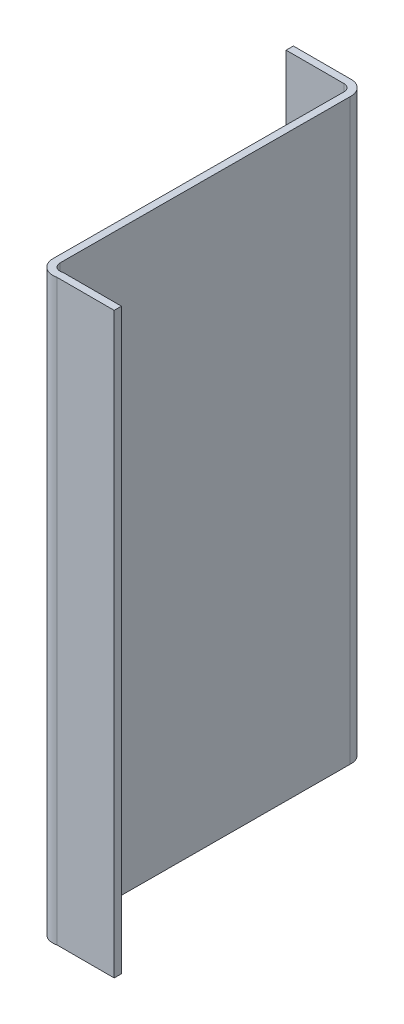
ISO-10303-21;
HEADER;
FILE_DESCRIPTION(('STEP AP214'),'2;1');
FILE_NAME('part.step','',(''),(''),'','','');
FILE_SCHEMA(('AUTOMOTIVE_DESIGN { 1 0 10303 214 1 1 1 1 }'));
ENDSEC;
DATA;
#1=APPLICATION_CONTEXT('core data for automotive mechanical design processes');
#2=APPLICATION_PROTOCOL_DEFINITION('international standard','automotive_design',2000,#1);
#3=PRODUCT_CONTEXT('',#1,'mechanical');
#4=PRODUCT('Part','Part','',(#3));
#5=PRODUCT_RELATED_PRODUCT_CATEGORY('part','',(#4));
#6=PRODUCT_DEFINITION_FORMATION('','',#4);
#7=PRODUCT_DEFINITION_CONTEXT('part definition',#1,'design');
#8=PRODUCT_DEFINITION('design','',#6,#7);
#9=PRODUCT_DEFINITION_SHAPE('','',#8);
#10=(LENGTH_UNIT() NAMED_UNIT(*) SI_UNIT(.MILLI.,.METRE.));
#11=(NAMED_UNIT(*) PLANE_ANGLE_UNIT() SI_UNIT($,.RADIAN.));
#12=(NAMED_UNIT(*) SI_UNIT($,.STERADIAN.) SOLID_ANGLE_UNIT());
#13=UNCERTAINTY_MEASURE_WITH_UNIT(LENGTH_MEASURE(1.E-05),#10,'distance_accuracy_value','');
#14=(GEOMETRIC_REPRESENTATION_CONTEXT(3) GLOBAL_UNCERTAINTY_ASSIGNED_CONTEXT((#13)) GLOBAL_UNIT_ASSIGNED_CONTEXT((#10,
#11,#12)) REPRESENTATION_CONTEXT('',''));
#15=CARTESIAN_POINT('',(0.,0.,0.));
#16=DIRECTION('',(0.,0.,1.));
#17=DIRECTION('',(1.,0.,0.));
#18=AXIS2_PLACEMENT_3D('',#15,#16,#17);
#19=CARTESIAN_POINT('',(9.66073389923838,400.,64.2333395643542));
#20=DIRECTION('',(0.,0.,-1.));
#21=DIRECTION('',(-1.,0.,0.));
#22=AXIS2_PLACEMENT_3D('',#19,#20,#21);
#23=PLANE('',#22);
#24=DIRECTION('',(1.,0.,0.));
#25=VECTOR('',#24,1.);
#26=CARTESIAN_POINT('',(9.66073389923838,0.,64.2333395643542));
#27=LINE('',#26,#25);
#28=CARTESIAN_POINT('',(10.0017111143668,0.,64.2333395643542));
#29=VERTEX_POINT('',#28);
#30=CARTESIAN_POINT('',(49.661853535489,0.,64.2333395643542));
#31=VERTEX_POINT('',#30);
#32=EDGE_CURVE('E164',#29,#31,#27,.T.);
#33=ORIENTED_EDGE('',*,*,#32,.T.);
#34=DIRECTION('',(0.,-1.,0.));
#35=VECTOR('',#34,1.);
#36=CARTESIAN_POINT('',(49.661853535489,400.,64.2333395643542));
#37=LINE('',#36,#35);
#38=CARTESIAN_POINT('',(49.661853535489,400.,64.2333395643542));
#39=VERTEX_POINT('',#38);
#40=EDGE_CURVE('E11',#39,#31,#37,.T.);
#41=ORIENTED_EDGE('',*,*,#40,.F.);
#42=DIRECTION('',(1.,0.,0.));
#43=VECTOR('',#42,1.);
#44=CARTESIAN_POINT('',(9.66073389923838,400.,64.2333395643542));
#45=LINE('',#44,#43);
#46=CARTESIAN_POINT('',(10.0017111143668,400.,64.2333395643542));
#47=VERTEX_POINT('',#46);
#48=EDGE_CURVE('E108',#47,#39,#45,.T.);
#49=ORIENTED_EDGE('',*,*,#48,.F.);
#50=DIRECTION('',(0.,-1.,0.));
#51=VECTOR('',#50,1.);
#52=CARTESIAN_POINT('',(10.0017111143668,400.,64.2333395643542));
#53=LINE('',#52,#51);
#54=EDGE_CURVE('E160',#47,#29,#53,.T.);
#55=ORIENTED_EDGE('',*,*,#54,.T.);
#56=EDGE_LOOP('',(#33,#41,#49,#55));
#57=FACE_BOUND('',#56,.T.);
#58=ADVANCED_FACE('F39',(#57),#23,.F.);
#59=CARTESIAN_POINT('',(49.661853535489,400.,59.2333395643542));
#60=DIRECTION('',(1.,0.,0.));
#61=DIRECTION('',(0.,0.,-1.));
#62=AXIS2_PLACEMENT_3D('',#59,#60,#61);
#63=PLANE('',#62);
#64=DIRECTION('',(0.,0.,1.));
#65=VECTOR('',#64,1.);
#66=CARTESIAN_POINT('',(49.661853535489,0.,59.2333395643542));
#67=LINE('',#66,#65);
#68=CARTESIAN_POINT('',(49.661853535489,0.,59.2333395643542));
#69=VERTEX_POINT('',#68);
#70=EDGE_CURVE('E168',#69,#31,#67,.T.);
#71=ORIENTED_EDGE('',*,*,#70,.F.);
#72=DIRECTION('',(0.,-1.,0.));
#73=VECTOR('',#72,1.);
#74=CARTESIAN_POINT('',(49.661853535489,400.,59.2333395643542));
#75=LINE('',#74,#73);
#76=CARTESIAN_POINT('',(49.661853535489,400.,59.2333395643542));
#77=VERTEX_POINT('',#76);
#78=EDGE_CURVE('E48',#77,#69,#75,.T.);
#79=ORIENTED_EDGE('',*,*,#78,.F.);
#80=DIRECTION('',(0.,0.,1.));
#81=VECTOR('',#80,1.);
#82=CARTESIAN_POINT('',(49.661853535489,400.,59.2333395643542));
#83=LINE('',#82,#81);
#84=EDGE_CURVE('E251',#77,#39,#83,.T.);
#85=ORIENTED_EDGE('',*,*,#84,.T.);
#86=ORIENTED_EDGE('',*,*,#40,.T.);
#87=EDGE_LOOP('',(#71,#79,#85,#86));
#88=FACE_BOUND('',#87,.T.);
#89=ADVANCED_FACE('F238',(#88),#63,.T.);
#90=CARTESIAN_POINT('',(9.66073389923838,400.,59.2333395643542));
#91=DIRECTION('',(0.,0.,-1.));
#92=DIRECTION('',(-1.,0.,0.));
#93=AXIS2_PLACEMENT_3D('',#90,#91,#92);
#94=PLANE('',#93);
#95=DIRECTION('',(1.,0.,0.));
#96=VECTOR('',#95,1.);
#97=CARTESIAN_POINT('',(9.66073389923838,0.,59.2333395643542));
#98=LINE('',#97,#96);
#99=CARTESIAN_POINT('',(9.25469740413768,0.,59.2333395643542));
#100=VERTEX_POINT('',#99);
#101=EDGE_CURVE('E172',#100,#69,#98,.T.);
#102=ORIENTED_EDGE('',*,*,#101,.F.);
#103=DIRECTION('',(0.,-1.,0.));
#104=VECTOR('',#103,1.);
#105=CARTESIAN_POINT('',(9.25469740413768,400.,59.2333395643542));
#106=LINE('',#105,#104);
#107=CARTESIAN_POINT('',(9.25469740413768,400.,59.2333395643542));
#108=VERTEX_POINT('',#107);
#109=EDGE_CURVE('E226',#108,#100,#106,.T.);
#110=ORIENTED_EDGE('',*,*,#109,.F.);
#111=DIRECTION('',(1.,0.,0.));
#112=VECTOR('',#111,1.);
#113=CARTESIAN_POINT('',(9.66073389923838,400.,59.2333395643542));
#114=LINE('',#113,#112);
#115=EDGE_CURVE('E235',#108,#77,#114,.T.);
#116=ORIENTED_EDGE('',*,*,#115,.T.);
#117=ORIENTED_EDGE('',*,*,#78,.T.);
#118=EDGE_LOOP('',(#102,#110,#116,#117));
#119=FACE_BOUND('',#118,.T.);
#120=ADVANCED_FACE('F233',(#119),#94,.T.);
#121=CARTESIAN_POINT('',(7.50015744719507,400.,54.5510656614804));
#122=DIRECTION('',(0.,-1.,0.));
#123=DIRECTION('',(0.,0.,-1.));
#124=AXIS2_PLACEMENT_3D('',#121,#122,#123);
#125=CYLINDRICAL_SURFACE('',#124,5.00020993179699);
#126=CARTESIAN_POINT('',(7.50015744719507,0.,54.5510656614804));
#127=DIRECTION('',(0.,1.,0.));
#128=DIRECTION('',(1.,0.,0.));
#129=AXIS2_PLACEMENT_3D('',#126,#127,#128);
#130=CIRCLE('',#129,5.00020993179699);
#131=CARTESIAN_POINT('',(2.49998250562238,0.,54.532359627433));
#132=VERTEX_POINT('',#131);
#133=EDGE_CURVE('E176',#132,#100,#130,.T.);
#134=ORIENTED_EDGE('',*,*,#133,.F.);
#135=DIRECTION('',(0.,-1.,0.));
#136=VECTOR('',#135,1.);
#137=CARTESIAN_POINT('',(2.49998250562238,400.,54.532359627433));
#138=LINE('',#137,#136);
#139=CARTESIAN_POINT('',(2.49998250562238,400.,54.532359627433));
#140=VERTEX_POINT('',#139);
#141=EDGE_CURVE('E223',#140,#132,#138,.T.);
#142=ORIENTED_EDGE('',*,*,#141,.F.);
#143=CARTESIAN_POINT('',(7.50015744719507,400.,54.5510656614804));
#144=DIRECTION('',(0.,1.,0.));
#145=DIRECTION('',(1.,0.,0.));
#146=AXIS2_PLACEMENT_3D('',#143,#144,#145);
#147=CIRCLE('',#146,5.00020993179699);
#148=EDGE_CURVE('E248',#140,#108,#147,.T.);
#149=ORIENTED_EDGE('',*,*,#148,.T.);
#150=ORIENTED_EDGE('',*,*,#109,.T.);
#151=EDGE_LOOP('',(#134,#142,#149,#150));
#152=FACE_BOUND('',#151,.T.);
#153=ADVANCED_FACE('F245',(#152),#125,.F.);
#154=CARTESIAN_POINT('',(3.24819768872956,400.,-145.467640372567));
#155=DIRECTION('',(0.999993002248951,0.,0.00374104973641801));
#156=DIRECTION('',(0.00374104973641801,0.,-0.999993002248951));
#157=AXIS2_PLACEMENT_3D('',#154,#155,#156);
#158=PLANE('',#157);
#159=DIRECTION('',(-0.00374104973641801,0.,0.999993002248951));
#160=VECTOR('',#159,1.);
#161=CARTESIAN_POINT('',(3.24819768872956,0.,-145.467640372567));
#162=LINE('',#161,#160);
#163=CARTESIAN_POINT('',(3.24784526707235,0.,-145.373437083146));
#164=VERTEX_POINT('',#163);
#165=EDGE_CURVE('E180',#164,#132,#162,.T.);
#166=ORIENTED_EDGE('',*,*,#165,.F.);
#167=DIRECTION('',(0.,-1.,0.));
#168=VECTOR('',#167,1.);
#169=CARTESIAN_POINT('',(3.24784526707235,400.,-145.373437083146));
#170=LINE('',#169,#168);
#171=CARTESIAN_POINT('',(3.24784526707235,400.,-145.373437083146));
#172=VERTEX_POINT('',#171);
#173=EDGE_CURVE('E220',#172,#164,#170,.T.);
#174=ORIENTED_EDGE('',*,*,#173,.F.);
#175=DIRECTION('',(-0.00374104973641801,0.,0.999993002248951));
#176=VECTOR('',#175,1.);
#177=CARTESIAN_POINT('',(3.24819768872956,400.,-145.467640372567));
#178=LINE('',#177,#176);
#179=EDGE_CURVE('E256',#172,#140,#178,.T.);
#180=ORIENTED_EDGE('',*,*,#179,.T.);
#181=ORIENTED_EDGE('',*,*,#141,.T.);
#182=EDGE_LOOP('',(#166,#174,#180,#181));
#183=FACE_BOUND('',#182,.T.);
#184=ADVANCED_FACE('F361',(#183),#158,.T.);
#185=CARTESIAN_POINT('',(-6.72498157597232,400.,-146.11297980582));
#186=DIRECTION('',(0.,-1.,0.));
#187=DIRECTION('',(0.,0.,-1.));
#188=AXIS2_PLACEMENT_3D('',#185,#186,#187);
#189=CYLINDRICAL_SURFACE('',#188,10.000209931797);
#190=CARTESIAN_POINT('',(-6.72498157597232,0.,-146.11297980582));
#191=DIRECTION('',(0.,1.,0.));
#192=DIRECTION('',(1.,0.,0.));
#193=AXIS2_PLACEMENT_3D('',#190,#191,#192);
#194=CIRCLE('',#193,10.000209931797);
#195=CARTESIAN_POINT('',(-6.72498157597232,0.,-156.113189737617));
#196=VERTEX_POINT('',#195);
#197=EDGE_CURVE('E184',#196,#164,#194,.F.);
#198=ORIENTED_EDGE('',*,*,#197,.F.);
#199=DIRECTION('',(0.,-1.,0.));
#200=VECTOR('',#199,1.);
#201=CARTESIAN_POINT('',(-6.72498157597232,400.,-156.113189737617));
#202=LINE('',#201,#200);
#203=CARTESIAN_POINT('',(-6.72498157597232,400.,-156.113189737617));
#204=VERTEX_POINT('',#203);
#205=EDGE_CURVE('E217',#204,#196,#202,.T.);
#206=ORIENTED_EDGE('',*,*,#205,.F.);
#207=CARTESIAN_POINT('',(-6.72498157597232,400.,-146.11297980582));
#208=DIRECTION('',(0.,1.,0.));
#209=DIRECTION('',(1.,0.,0.));
#210=AXIS2_PLACEMENT_3D('',#207,#208,#209);
#211=CIRCLE('',#210,10.000209931797);
#212=EDGE_CURVE('E263',#204,#172,#211,.F.);
#213=ORIENTED_EDGE('',*,*,#212,.T.);
#214=ORIENTED_EDGE('',*,*,#173,.T.);
#215=EDGE_LOOP('',(#198,#206,#213,#214));
#216=FACE_BOUND('',#215,.T.);
#217=ADVANCED_FACE('F352',(#216),#189,.T.);
#218=CARTESIAN_POINT('',(-46.726101212223,400.,-156.113189737617));
#219=DIRECTION('',(0.,0.,-1.));
#220=DIRECTION('',(-1.,0.,0.));
#221=AXIS2_PLACEMENT_3D('',#218,#219,#220);
#222=PLANE('',#221);
#223=DIRECTION('',(1.,0.,0.));
#224=VECTOR('',#223,1.);
#225=CARTESIAN_POINT('',(-46.726101212223,0.,-156.113189737617));
#226=LINE('',#225,#224);
#227=CARTESIAN_POINT('',(-46.726101212223,0.,-156.113189737617));
#228=VERTEX_POINT('',#227);
#229=EDGE_CURVE('E188',#228,#196,#226,.T.);
#230=ORIENTED_EDGE('',*,*,#229,.F.);
#231=DIRECTION('',(0.,-1.,0.));
#232=VECTOR('',#231,1.);
#233=CARTESIAN_POINT('',(-46.726101212223,400.,-156.113189737617));
#234=LINE('',#233,#232);
#235=CARTESIAN_POINT('',(-46.726101212223,400.,-156.113189737617));
#236=VERTEX_POINT('',#235);
#237=EDGE_CURVE('E214',#236,#228,#234,.T.);
#238=ORIENTED_EDGE('',*,*,#237,.F.);
#239=DIRECTION('',(1.,0.,0.));
#240=VECTOR('',#239,1.);
#241=CARTESIAN_POINT('',(-46.726101212223,400.,-156.113189737617));
#242=LINE('',#241,#240);
#243=EDGE_CURVE('E267',#236,#204,#242,.T.);
#244=ORIENTED_EDGE('',*,*,#243,.T.);
#245=ORIENTED_EDGE('',*,*,#205,.T.);
#246=EDGE_LOOP('',(#230,#238,#244,#245));
#247=FACE_BOUND('',#246,.T.);
#248=ADVANCED_FACE('F282',(#247),#222,.T.);
#249=CARTESIAN_POINT('',(-46.726101212223,400.,-151.113189737617));
#250=DIRECTION('',(-1.,0.,0.));
#251=DIRECTION('',(0.,0.,1.));
#252=AXIS2_PLACEMENT_3D('',#249,#250,#251);
#253=PLANE('',#252);
#254=DIRECTION('',(0.,0.,-1.));
#255=VECTOR('',#254,1.);
#256=CARTESIAN_POINT('',(-46.726101212223,0.,-151.113189737617));
#257=LINE('',#256,#255);
#258=CARTESIAN_POINT('',(-46.726101212223,0.,-151.113189737617));
#259=VERTEX_POINT('',#258);
#260=EDGE_CURVE('E192',#259,#228,#257,.T.);
#261=ORIENTED_EDGE('',*,*,#260,.F.);
#262=DIRECTION('',(0.,-1.,0.));
#263=VECTOR('',#262,1.);
#264=CARTESIAN_POINT('',(-46.726101212223,400.,-151.113189737617));
#265=LINE('',#264,#263);
#266=CARTESIAN_POINT('',(-46.726101212223,400.,-151.113189737617));
#267=VERTEX_POINT('',#266);
#268=EDGE_CURVE('E211',#267,#259,#265,.T.);
#269=ORIENTED_EDGE('',*,*,#268,.F.);
#270=DIRECTION('',(0.,0.,-1.));
#271=VECTOR('',#270,1.);
#272=CARTESIAN_POINT('',(-46.726101212223,400.,-151.113189737617));
#273=LINE('',#272,#271);
#274=EDGE_CURVE('E271',#267,#236,#273,.T.);
#275=ORIENTED_EDGE('',*,*,#274,.T.);
#276=ORIENTED_EDGE('',*,*,#237,.T.);
#277=EDGE_LOOP('',(#261,#269,#275,#276));
#278=FACE_BOUND('',#277,.T.);
#279=ADVANCED_FACE('F277',(#278),#253,.T.);
#280=CARTESIAN_POINT('',(-46.726101212223,400.,-151.113189737617));
#281=DIRECTION('',(0.,0.,-1.));
#282=DIRECTION('',(-1.,0.,0.));
#283=AXIS2_PLACEMENT_3D('',#280,#281,#282);
#284=PLANE('',#283);
#285=DIRECTION('',(1.,0.,0.));
#286=VECTOR('',#285,1.);
#287=CARTESIAN_POINT('',(-46.726101212223,0.,-151.113189737617));
#288=LINE('',#287,#286);
#289=CARTESIAN_POINT('',(-6.72498157597232,0.,-151.113189737617));
#290=VERTEX_POINT('',#289);
#291=EDGE_CURVE('E196',#259,#290,#288,.T.);
#292=ORIENTED_EDGE('',*,*,#291,.T.);
#293=DIRECTION('',(0.,-1.,0.));
#294=VECTOR('',#293,1.);
#295=CARTESIAN_POINT('',(-6.72498157597232,400.,-151.113189737617));
#296=LINE('',#295,#294);
#297=CARTESIAN_POINT('',(-6.72498157597232,400.,-151.113189737617));
#298=VERTEX_POINT('',#297);
#299=EDGE_CURVE('E153',#298,#290,#296,.T.);
#300=ORIENTED_EDGE('',*,*,#299,.F.);
#301=DIRECTION('',(1.,0.,0.));
#302=VECTOR('',#301,1.);
#303=CARTESIAN_POINT('',(-46.726101212223,400.,-151.113189737617));
#304=LINE('',#303,#302);
#305=EDGE_CURVE('E142',#267,#298,#304,.T.);
#306=ORIENTED_EDGE('',*,*,#305,.F.);
#307=ORIENTED_EDGE('',*,*,#268,.T.);
#308=EDGE_LOOP('',(#292,#300,#306,#307));
#309=FACE_BOUND('',#308,.T.);
#310=ADVANCED_FACE('F286',(#309),#284,.F.);
#311=CARTESIAN_POINT('',(-6.72498157597232,400.,-146.11297980582));
#312=DIRECTION('',(0.,-1.,0.));
#313=DIRECTION('',(0.,0.,-1.));
#314=AXIS2_PLACEMENT_3D('',#311,#312,#313);
#315=CYLINDRICAL_SURFACE('',#314,5.000209931797);
#316=CARTESIAN_POINT('',(-6.72498157597232,0.,-146.11297980582));
#317=DIRECTION('',(0.,1.,0.));
#318=DIRECTION('',(1.,0.,0.));
#319=AXIS2_PLACEMENT_3D('',#316,#317,#318);
#320=CIRCLE('',#319,5.000209931797);
#321=CARTESIAN_POINT('',(-1.75134916379334,0.,-145.598120610929));
#322=VERTEX_POINT('',#321);
#323=EDGE_CURVE('E151',#290,#322,#320,.F.);
#324=ORIENTED_EDGE('',*,*,#323,.T.);
#325=DIRECTION('',(0.,-1.,0.));
#326=VECTOR('',#325,1.);
#327=CARTESIAN_POINT('',(-1.75134916379334,400.,-145.598120610929));
#328=LINE('',#327,#326);
#329=CARTESIAN_POINT('',(-1.75134916379334,400.,-145.598120610929));
#330=VERTEX_POINT('',#329);
#331=EDGE_CURVE('E148',#330,#322,#328,.T.);
#332=ORIENTED_EDGE('',*,*,#331,.F.);
#333=CARTESIAN_POINT('',(-6.72498157597232,400.,-146.11297980582));
#334=DIRECTION('',(0.,1.,0.));
#335=DIRECTION('',(1.,0.,0.));
#336=AXIS2_PLACEMENT_3D('',#333,#334,#335);
#337=CIRCLE('',#336,5.000209931797);
#338=EDGE_CURVE('E135',#298,#330,#337,.F.);
#339=ORIENTED_EDGE('',*,*,#338,.F.);
#340=ORIENTED_EDGE('',*,*,#299,.T.);
#341=EDGE_LOOP('',(#324,#332,#339,#340));
#342=FACE_BOUND('',#341,.T.);
#343=ADVANCED_FACE('F149',(#342),#315,.F.);
#344=CARTESIAN_POINT('',(-1.75176732251519,400.,-145.486345621249));
#345=DIRECTION('',(0.999993002248951,0.,0.00374104973641801));
#346=DIRECTION('',(0.00374104973641801,0.,-0.999993002248951));
#347=AXIS2_PLACEMENT_3D('',#344,#345,#346);
#348=PLANE('',#347);
#349=DIRECTION('',(-0.00374104973641801,0.,0.999993002248951));
#350=VECTOR('',#349,1.);
#351=CARTESIAN_POINT('',(-1.75176732251519,0.,-145.486345621249));
#352=LINE('',#351,#350);
#353=CARTESIAN_POINT('',(-2.49998250562238,0.,54.5136543787509));
#354=VERTEX_POINT('',#353);
#355=EDGE_CURVE('E96',#322,#354,#352,.T.);
#356=ORIENTED_EDGE('',*,*,#355,.T.);
#357=DIRECTION('',(0.,-1.,0.));
#358=VECTOR('',#357,1.);
#359=CARTESIAN_POINT('',(-2.49998250562238,400.,54.5136543787509));
#360=LINE('',#359,#358);
#361=CARTESIAN_POINT('',(-2.49998250562238,400.,54.5136543787509));
#362=VERTEX_POINT('',#361);
#363=EDGE_CURVE('E154',#362,#354,#360,.T.);
#364=ORIENTED_EDGE('',*,*,#363,.F.);
#365=DIRECTION('',(-0.00374104973641801,0.,0.999993002248951));
#366=VECTOR('',#365,1.);
#367=CARTESIAN_POINT('',(-1.75176732251519,400.,-145.486345621249));
#368=LINE('',#367,#366);
#369=EDGE_CURVE('E139',#330,#362,#368,.T.);
#370=ORIENTED_EDGE('',*,*,#369,.F.);
#371=ORIENTED_EDGE('',*,*,#331,.T.);
#372=EDGE_LOOP('',(#356,#364,#370,#371));
#373=FACE_BOUND('',#372,.T.);
#374=ADVANCED_FACE('F156',(#373),#348,.F.);
#375=CARTESIAN_POINT('',(7.50015744719507,400.,54.5510656614804));
#376=DIRECTION('',(0.,-1.,0.));
#377=DIRECTION('',(0.,0.,-1.));
#378=AXIS2_PLACEMENT_3D('',#375,#376,#377);
#379=CYLINDRICAL_SURFACE('',#378,10.000209931797);
#380=CARTESIAN_POINT('',(7.50015744719507,0.,54.5510656614804));
#381=DIRECTION('',(0.,1.,0.));
#382=DIRECTION('',(1.,0.,0.));
#383=AXIS2_PLACEMENT_3D('',#380,#381,#382);
#384=CIRCLE('',#383,10.000209931797);
#385=EDGE_CURVE('E102',#354,#29,#384,.T.);
#386=ORIENTED_EDGE('',*,*,#385,.T.);
#387=ORIENTED_EDGE('',*,*,#54,.F.);
#388=CARTESIAN_POINT('',(7.50015744719507,400.,54.5510656614804));
#389=DIRECTION('',(0.,1.,0.));
#390=DIRECTION('',(1.,0.,0.));
#391=AXIS2_PLACEMENT_3D('',#388,#389,#390);
#392=CIRCLE('',#391,10.000209931797);
#393=EDGE_CURVE('E56',#362,#47,#392,.T.);
#394=ORIENTED_EDGE('',*,*,#393,.F.);
#395=ORIENTED_EDGE('',*,*,#363,.T.);
#396=EDGE_LOOP('',(#386,#387,#394,#395));
#397=FACE_BOUND('',#396,.T.);
#398=ADVANCED_FACE('F300',(#397),#379,.T.);
#399=CARTESIAN_POINT('',(7.50015744719507,400.,54.5510656614804));
#400=DIRECTION('',(0.,1.,0.));
#401=DIRECTION('',(1.,0.,0.));
#402=AXIS2_PLACEMENT_3D('',#399,#400,#401);
#403=PLANE('',#402);
#404=ORIENTED_EDGE('',*,*,#48,.T.);
#405=ORIENTED_EDGE('',*,*,#84,.F.);
#406=ORIENTED_EDGE('',*,*,#115,.F.);
#407=ORIENTED_EDGE('',*,*,#148,.F.);
#408=ORIENTED_EDGE('',*,*,#179,.F.);
#409=ORIENTED_EDGE('',*,*,#212,.F.);
#410=ORIENTED_EDGE('',*,*,#243,.F.);
#411=ORIENTED_EDGE('',*,*,#274,.F.);
#412=ORIENTED_EDGE('',*,*,#305,.T.);
#413=ORIENTED_EDGE('',*,*,#338,.T.);
#414=ORIENTED_EDGE('',*,*,#369,.T.);
#415=ORIENTED_EDGE('',*,*,#393,.T.);
#416=EDGE_LOOP('',(#404,#405,#406,#407,#408,#409,#410,#411,#412,#413,#414,#415));
#417=FACE_BOUND('',#416,.T.);
#418=ADVANCED_FACE('F137',(#417),#403,.T.);
#419=CARTESIAN_POINT('',(7.50015744719507,0.,54.5510656614804));
#420=DIRECTION('',(0.,1.,0.));
#421=DIRECTION('',(1.,0.,0.));
#422=AXIS2_PLACEMENT_3D('',#419,#420,#421);
#423=PLANE('',#422);
#424=ORIENTED_EDGE('',*,*,#32,.F.);
#425=ORIENTED_EDGE('',*,*,#385,.F.);
#426=ORIENTED_EDGE('',*,*,#355,.F.);
#427=ORIENTED_EDGE('',*,*,#323,.F.);
#428=ORIENTED_EDGE('',*,*,#291,.F.);
#429=ORIENTED_EDGE('',*,*,#260,.T.);
#430=ORIENTED_EDGE('',*,*,#229,.T.);
#431=ORIENTED_EDGE('',*,*,#197,.T.);
#432=ORIENTED_EDGE('',*,*,#165,.T.);
#433=ORIENTED_EDGE('',*,*,#133,.T.);
#434=ORIENTED_EDGE('',*,*,#101,.T.);
#435=ORIENTED_EDGE('',*,*,#70,.T.);
#436=EDGE_LOOP('',(#424,#425,#426,#427,#428,#429,#430,#431,#432,#433,#434,#435));
#437=FACE_BOUND('',#436,.T.);
#438=ADVANCED_FACE('F241',(#437),#423,.F.);
#439=CLOSED_SHELL('',(#58,#89,#120,#153,#184,#217,#248,#279,#310,#343,#374,#398,#418,#438));
#440=MANIFOLD_SOLID_BREP('B2',#439);
#441=ADVANCED_BREP_SHAPE_REPRESENTATION('',(#18,#440),#14);
#442=SHAPE_DEFINITION_REPRESENTATION(#9,#441);
ENDSEC;
END-ISO-10303-21;
